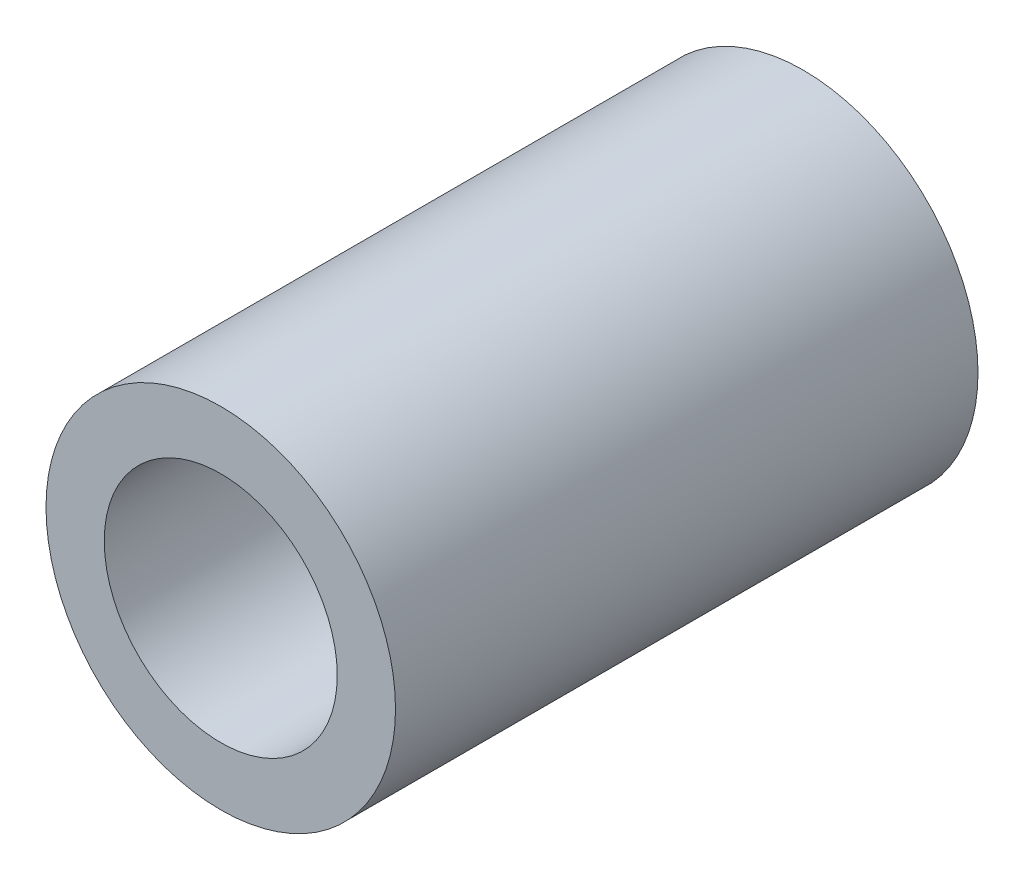
ISO-10303-21;
HEADER;
FILE_DESCRIPTION(('STEP AP214'),'2;1');
FILE_NAME('part.step','',(''),(''),'','','');
FILE_SCHEMA(('AUTOMOTIVE_DESIGN { 1 0 10303 214 1 1 1 1 }'));
ENDSEC;
DATA;
#1=APPLICATION_CONTEXT('core data for automotive mechanical design processes');
#2=APPLICATION_PROTOCOL_DEFINITION('international standard','automotive_design',2000,#1);
#3=PRODUCT_CONTEXT('',#1,'mechanical');
#4=PRODUCT('Part','Part','',(#3));
#5=PRODUCT_RELATED_PRODUCT_CATEGORY('part','',(#4));
#6=PRODUCT_DEFINITION_FORMATION('','',#4);
#7=PRODUCT_DEFINITION_CONTEXT('part definition',#1,'design');
#8=PRODUCT_DEFINITION('design','',#6,#7);
#9=PRODUCT_DEFINITION_SHAPE('','',#8);
#10=(LENGTH_UNIT() NAMED_UNIT(*) SI_UNIT(.MILLI.,.METRE.));
#11=(NAMED_UNIT(*) PLANE_ANGLE_UNIT() SI_UNIT($,.RADIAN.));
#12=(NAMED_UNIT(*) SI_UNIT($,.STERADIAN.) SOLID_ANGLE_UNIT());
#13=UNCERTAINTY_MEASURE_WITH_UNIT(LENGTH_MEASURE(1.E-05),#10,'distance_accuracy_value','');
#14=(GEOMETRIC_REPRESENTATION_CONTEXT(3) GLOBAL_UNCERTAINTY_ASSIGNED_CONTEXT((#13)) GLOBAL_UNIT_ASSIGNED_CONTEXT((#10,
#11,#12)) REPRESENTATION_CONTEXT('',''));
#15=CARTESIAN_POINT('',(0.,0.,0.));
#16=DIRECTION('',(0.,0.,1.));
#17=DIRECTION('',(1.,0.,0.));
#18=AXIS2_PLACEMENT_3D('',#15,#16,#17);
#19=CARTESIAN_POINT('',(0.,0.,15.));
#20=DIRECTION('',(0.,0.,-1.));
#21=DIRECTION('',(-1.,0.,0.));
#22=AXIS2_PLACEMENT_3D('',#19,#20,#21);
#23=CYLINDRICAL_SURFACE('',#22,4.5);
#24=CARTESIAN_POINT('',(0.,0.,15.));
#25=DIRECTION('',(0.,0.,1.));
#26=DIRECTION('',(1.,0.,0.));
#27=AXIS2_PLACEMENT_3D('',#24,#25,#26);
#28=CIRCLE('',#27,4.5);
#29=CARTESIAN_POINT('',(4.5,0.,15.));
#30=VERTEX_POINT('',#29);
#31=EDGE_CURVE('E10',#30,#30,#28,.T.);
#32=ORIENTED_EDGE('',*,*,#31,.F.);
#33=EDGE_LOOP('',(#32));
#34=FACE_BOUND('',#33,.T.);
#35=CARTESIAN_POINT('',(0.,0.,0.));
#36=DIRECTION('',(0.,0.,1.));
#37=DIRECTION('',(1.,0.,0.));
#38=AXIS2_PLACEMENT_3D('',#35,#36,#37);
#39=CIRCLE('',#38,4.5);
#40=CARTESIAN_POINT('',(4.5,0.,0.));
#41=VERTEX_POINT('',#40);
#42=EDGE_CURVE('E35',#41,#41,#39,.T.);
#43=ORIENTED_EDGE('',*,*,#42,.T.);
#44=EDGE_LOOP('',(#43));
#45=FACE_BOUND('',#44,.T.);
#46=ADVANCED_FACE('F32',(#34,#45),#23,.T.);
#47=CARTESIAN_POINT('',(0.,0.,15.));
#48=DIRECTION('',(0.,0.,1.));
#49=DIRECTION('',(1.,0.,0.));
#50=AXIS2_PLACEMENT_3D('',#47,#48,#49);
#51=PLANE('',#50);
#52=CARTESIAN_POINT('',(0.,0.,15.));
#53=DIRECTION('',(0.,0.,1.));
#54=DIRECTION('',(1.,0.,0.));
#55=AXIS2_PLACEMENT_3D('',#52,#53,#54);
#56=CIRCLE('',#55,3.);
#57=CARTESIAN_POINT('',(3.,0.,15.));
#58=VERTEX_POINT('',#57);
#59=EDGE_CURVE('E44',#58,#58,#56,.T.);
#60=ORIENTED_EDGE('',*,*,#59,.F.);
#61=EDGE_LOOP('',(#60));
#62=FACE_BOUND('',#61,.T.);
#63=ORIENTED_EDGE('',*,*,#31,.T.);
#64=EDGE_LOOP('',(#63));
#65=FACE_BOUND('',#64,.T.);
#66=ADVANCED_FACE('F69',(#62,#65),#51,.T.);
#67=CARTESIAN_POINT('',(0.,0.,0.));
#68=DIRECTION('',(0.,0.,1.));
#69=DIRECTION('',(1.,0.,0.));
#70=AXIS2_PLACEMENT_3D('',#67,#68,#69);
#71=PLANE('',#70);
#72=CARTESIAN_POINT('',(0.,0.,0.));
#73=DIRECTION('',(0.,0.,-1.));
#74=DIRECTION('',(-1.,0.,0.));
#75=AXIS2_PLACEMENT_3D('',#72,#73,#74);
#76=CIRCLE('',#75,2.);
#77=CARTESIAN_POINT('',(-2.,0.,0.));
#78=VERTEX_POINT('',#77);
#79=EDGE_CURVE('E50',#78,#78,#76,.T.);
#80=ORIENTED_EDGE('',*,*,#79,.F.);
#81=EDGE_LOOP('',(#80));
#82=FACE_BOUND('',#81,.T.);
#83=ORIENTED_EDGE('',*,*,#42,.F.);
#84=EDGE_LOOP('',(#83));
#85=FACE_BOUND('',#84,.T.);
#86=ADVANCED_FACE('F65',(#82,#85),#71,.F.);
#87=CARTESIAN_POINT('',(0.,0.,10.));
#88=DIRECTION('',(0.,0.,1.));
#89=DIRECTION('',(1.,0.,0.));
#90=AXIS2_PLACEMENT_3D('',#87,#88,#89);
#91=CYLINDRICAL_SURFACE('',#90,3.);
#92=CARTESIAN_POINT('',(0.,0.,10.));
#93=DIRECTION('',(0.,0.,1.));
#94=DIRECTION('',(1.,0.,0.));
#95=AXIS2_PLACEMENT_3D('',#92,#93,#94);
#96=CIRCLE('',#95,3.);
#97=CARTESIAN_POINT('',(3.,0.,10.));
#98=VERTEX_POINT('',#97);
#99=EDGE_CURVE('E42',#98,#98,#96,.T.);
#100=ORIENTED_EDGE('',*,*,#99,.F.);
#101=EDGE_LOOP('',(#100));
#102=FACE_BOUND('',#101,.T.);
#103=ORIENTED_EDGE('',*,*,#59,.T.);
#104=EDGE_LOOP('',(#103));
#105=FACE_BOUND('',#104,.T.);
#106=ADVANCED_FACE('F68',(#102,#105),#91,.F.);
#107=CARTESIAN_POINT('',(0.,0.,10.));
#108=DIRECTION('',(0.,0.,1.));
#109=DIRECTION('',(1.,0.,0.));
#110=AXIS2_PLACEMENT_3D('',#107,#108,#109);
#111=PLANE('',#110);
#112=ORIENTED_EDGE('',*,*,#99,.T.);
#113=EDGE_LOOP('',(#112));
#114=FACE_BOUND('',#113,.T.);
#115=ADVANCED_FACE('F61',(#114),#111,.T.);
#116=CARTESIAN_POINT('',(0.,0.,5.));
#117=DIRECTION('',(0.,0.,-1.));
#118=DIRECTION('',(-1.,0.,0.));
#119=AXIS2_PLACEMENT_3D('',#116,#117,#118);
#120=CYLINDRICAL_SURFACE('',#119,2.);
#121=CARTESIAN_POINT('',(0.,0.,5.));
#122=DIRECTION('',(0.,0.,-1.));
#123=DIRECTION('',(-1.,0.,0.));
#124=AXIS2_PLACEMENT_3D('',#121,#122,#123);
#125=CIRCLE('',#124,2.);
#126=CARTESIAN_POINT('',(-2.,0.,5.));
#127=VERTEX_POINT('',#126);
#128=EDGE_CURVE('E47',#127,#127,#125,.T.);
#129=ORIENTED_EDGE('',*,*,#128,.F.);
#130=EDGE_LOOP('',(#129));
#131=FACE_BOUND('',#130,.T.);
#132=ORIENTED_EDGE('',*,*,#79,.T.);
#133=EDGE_LOOP('',(#132));
#134=FACE_BOUND('',#133,.T.);
#135=ADVANCED_FACE('F58',(#131,#134),#120,.F.);
#136=CARTESIAN_POINT('',(0.,0.,5.));
#137=DIRECTION('',(0.,0.,-1.));
#138=DIRECTION('',(-1.,0.,0.));
#139=AXIS2_PLACEMENT_3D('',#136,#137,#138);
#140=PLANE('',#139);
#141=ORIENTED_EDGE('',*,*,#128,.T.);
#142=EDGE_LOOP('',(#141));
#143=FACE_BOUND('',#142,.T.);
#144=ADVANCED_FACE('F56',(#143),#140,.T.);
#145=CLOSED_SHELL('',(#46,#66,#86,#106,#115,#135,#144));
#146=MANIFOLD_SOLID_BREP('B2',#145);
#147=ADVANCED_BREP_SHAPE_REPRESENTATION('',(#18,#146),#14);
#148=SHAPE_DEFINITION_REPRESENTATION(#9,#147);
ENDSEC;
END-ISO-10303-21;
